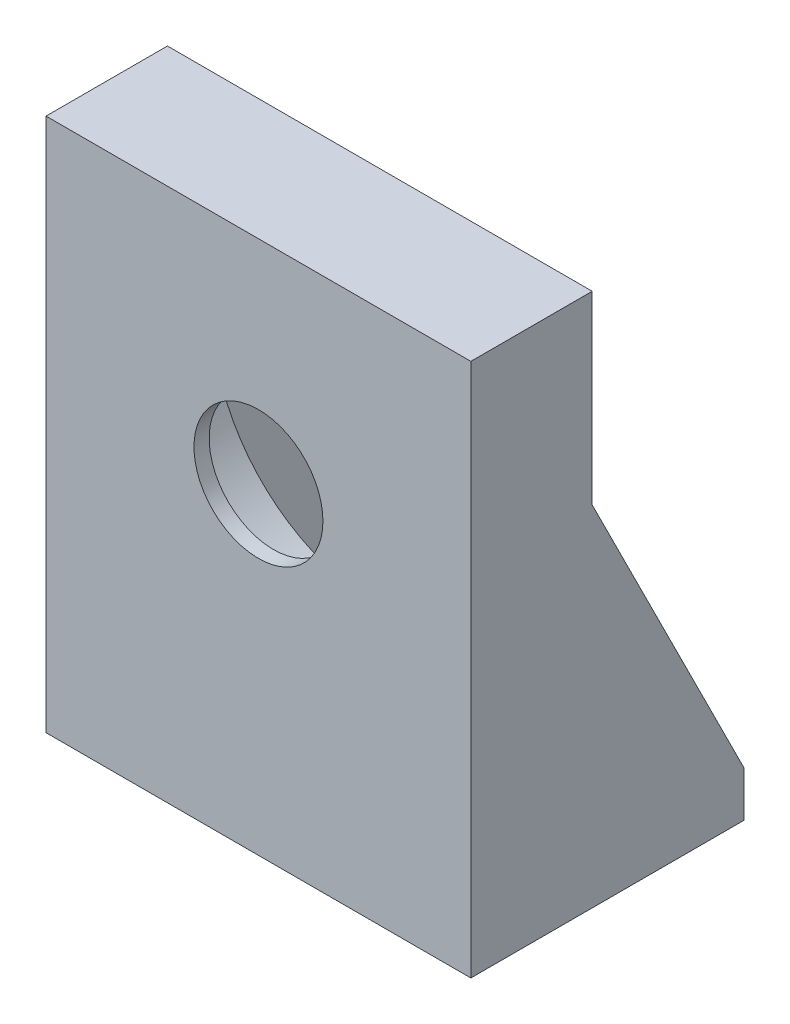
ISO-10303-21;
HEADER;
FILE_DESCRIPTION(('STEP AP214'),'2;1');
FILE_NAME('part.step','',(''),(''),'','','');
FILE_SCHEMA(('AUTOMOTIVE_DESIGN { 1 0 10303 214 1 1 1 1 }'));
ENDSEC;
DATA;
#1=APPLICATION_CONTEXT('core data for automotive mechanical design processes');
#2=APPLICATION_PROTOCOL_DEFINITION('international standard','automotive_design',2000,#1);
#3=PRODUCT_CONTEXT('',#1,'mechanical');
#4=PRODUCT('Part','Part','',(#3));
#5=PRODUCT_RELATED_PRODUCT_CATEGORY('part','',(#4));
#6=PRODUCT_DEFINITION_FORMATION('','',#4);
#7=PRODUCT_DEFINITION_CONTEXT('part definition',#1,'design');
#8=PRODUCT_DEFINITION('design','',#6,#7);
#9=PRODUCT_DEFINITION_SHAPE('','',#8);
#10=(LENGTH_UNIT() NAMED_UNIT(*) SI_UNIT(.MILLI.,.METRE.));
#11=(NAMED_UNIT(*) PLANE_ANGLE_UNIT() SI_UNIT($,.RADIAN.));
#12=(NAMED_UNIT(*) SI_UNIT($,.STERADIAN.) SOLID_ANGLE_UNIT());
#13=UNCERTAINTY_MEASURE_WITH_UNIT(LENGTH_MEASURE(1.E-05),#10,'distance_accuracy_value','');
#14=(GEOMETRIC_REPRESENTATION_CONTEXT(3) GLOBAL_UNCERTAINTY_ASSIGNED_CONTEXT((#13)) GLOBAL_UNIT_ASSIGNED_CONTEXT((#10,
#11,#12)) REPRESENTATION_CONTEXT('',''));
#15=CARTESIAN_POINT('',(0.,0.,0.));
#16=DIRECTION('',(0.,0.,1.));
#17=DIRECTION('',(1.,0.,0.));
#18=AXIS2_PLACEMENT_3D('',#15,#16,#17);
#19=CARTESIAN_POINT('',(-78.7321078244736,23.0359502095329,-9.53844798598299));
#20=DIRECTION('',(0.,0.,1.00000000000001));
#21=DIRECTION('',(0.99999999999995,0.,0.));
#22=AXIS2_PLACEMENT_3D('',#19,#20,#21);
#23=PLANE('',#22);
#24=DIRECTION('',(0.,-1.,0.));
#25=VECTOR('',#24,1.);
#26=CARTESIAN_POINT('',(-67.7321078244726,0.,-9.53844798598301));
#27=LINE('',#26,#25);
#28=CARTESIAN_POINT('',(-67.7321078244728,23.0359502095306,-9.53844798598299));
#29=VERTEX_POINT('',#28);
#30=CARTESIAN_POINT('',(-67.7321078244726,4.83595020952913,-9.53844798598301));
#31=VERTEX_POINT('',#30);
#32=EDGE_CURVE('E60',#29,#31,#27,.T.);
#33=ORIENTED_EDGE('',*,*,#32,.T.);
#34=DIRECTION('',(-1.,0.,0.));
#35=VECTOR('',#34,1.);
#36=CARTESIAN_POINT('',(-54.2918013155621,4.83595020952913,-9.53844798598301));
#37=LINE('',#36,#35);
#38=CARTESIAN_POINT('',(-89.7321078244726,4.83595020952913,-9.53844798598301));
#39=VERTEX_POINT('',#38);
#40=EDGE_CURVE('E196',#31,#39,#37,.T.);
#41=ORIENTED_EDGE('',*,*,#40,.T.);
#42=DIRECTION('',(0.,-1.,0.));
#43=VECTOR('',#42,1.);
#44=CARTESIAN_POINT('',(-89.7321078244726,0.,-9.53844798598301));
#45=LINE('',#44,#43);
#46=CARTESIAN_POINT('',(-89.7321078244727,23.0359502095306,-9.538447985983));
#47=VERTEX_POINT('',#46);
#48=EDGE_CURVE('E182',#47,#39,#45,.T.);
#49=ORIENTED_EDGE('',*,*,#48,.F.);
#50=CARTESIAN_POINT('',(-78.7321078244726,23.0359502095306,-9.53844798598299));
#51=DIRECTION('',(0.,0.,1.00000000000001));
#52=DIRECTION('',(0.,-1.,0.));
#53=AXIS2_PLACEMENT_3D('',#50,#51,#52);
#54=CIRCLE('',#53,10.9999999999998);
#55=EDGE_CURVE('E44',#29,#47,#54,.F.);
#56=ORIENTED_EDGE('',*,*,#55,.F.);
#57=EDGE_LOOP('',(#33,#41,#49,#56));
#58=FACE_BOUND('',#57,.T.);
#59=ADVANCED_FACE('F35',(#58),#23,.F.);
#60=CARTESIAN_POINT('',(-54.2918013155621,4.83595020952913,0.));
#61=DIRECTION('',(0.,-1.,0.));
#62=DIRECTION('',(0.,0.,-1.));
#63=AXIS2_PLACEMENT_3D('',#60,#61,#62);
#64=PLANE('',#63);
#65=CARTESIAN_POINT('',(-72.7321078244726,4.83595020952913,-14.5384479859829));
#66=DIRECTION('',(0.,1.,0.));
#67=DIRECTION('',(0.,0.,1.));
#68=AXIS2_PLACEMENT_3D('',#65,#66,#67);
#69=CIRCLE('',#68,2.00000000000238);
#70=CARTESIAN_POINT('',(-72.7321078244726,4.83595020952913,-12.5384479859806));
#71=VERTEX_POINT('',#70);
#72=EDGE_CURVE('E156',#71,#71,#69,.T.);
#73=ORIENTED_EDGE('',*,*,#72,.F.);
#74=EDGE_LOOP('',(#73));
#75=FACE_BOUND('',#74,.T.);
#76=CARTESIAN_POINT('',(-84.7321078244726,4.83595020952913,-14.5384479859829));
#77=DIRECTION('',(0.,1.,0.));
#78=DIRECTION('',(0.,0.,-1.));
#79=AXIS2_PLACEMENT_3D('',#76,#77,#78);
#80=CIRCLE('',#79,2.00000000000238);
#81=CARTESIAN_POINT('',(-84.7321078244726,4.83595020952913,-16.5384479859853));
#82=VERTEX_POINT('',#81);
#83=EDGE_CURVE('E162',#82,#82,#80,.T.);
#84=ORIENTED_EDGE('',*,*,#83,.F.);
#85=EDGE_LOOP('',(#84));
#86=FACE_BOUND('',#85,.T.);
#87=DIRECTION('',(0.,0.,1.));
#88=VECTOR('',#87,1.);
#89=CARTESIAN_POINT('',(-67.7321078244726,4.83595020952913,-54.5166649359701));
#90=LINE('',#89,#88);
#91=CARTESIAN_POINT('',(-67.7321078244726,4.83595020952914,-19.5384479859829));
#92=VERTEX_POINT('',#91);
#93=EDGE_CURVE('E165',#92,#31,#90,.T.);
#94=ORIENTED_EDGE('',*,*,#93,.F.);
#95=DIRECTION('',(-1.,0.,0.));
#96=VECTOR('',#95,1.);
#97=CARTESIAN_POINT('',(-54.2918013155621,4.83595020952913,-19.5384479859829));
#98=LINE('',#97,#96);
#99=CARTESIAN_POINT('',(-89.7321078244726,4.83595020952913,-19.5384479859829));
#100=VERTEX_POINT('',#99);
#101=EDGE_CURVE('E195',#92,#100,#98,.T.);
#102=ORIENTED_EDGE('',*,*,#101,.T.);
#103=DIRECTION('',(0.,0.,1.));
#104=VECTOR('',#103,1.);
#105=CARTESIAN_POINT('',(-89.7321078244726,4.83595020952913,0.));
#106=LINE('',#105,#104);
#107=EDGE_CURVE('E179',#100,#39,#106,.T.);
#108=ORIENTED_EDGE('',*,*,#107,.T.);
#109=ORIENTED_EDGE('',*,*,#40,.F.);
#110=EDGE_LOOP('',(#94,#102,#108,#109));
#111=FACE_BOUND('',#110,.T.);
#112=ADVANCED_FACE('F260',(#75,#86,#111),#64,.F.);
#113=DIRECTION('',(0.,1.,0.));
#114=VECTOR('',#113,1.);
#115=CARTESIAN_POINT('',(-64.7321078244726,0.,-9.538447985983));
#116=LINE('',#115,#114);
#117=CARTESIAN_POINT('',(-64.7321078244726,24.8359502095291,-9.53844798598299));
#118=VERTEX_POINT('',#117);
#119=CARTESIAN_POINT('',(-64.7321078244726,37.0359502095306,-9.53844798598299));
#120=VERTEX_POINT('',#119);
#121=EDGE_CURVE('E120',#118,#120,#116,.T.);
#122=ORIENTED_EDGE('',*,*,#121,.F.);
#123=DIRECTION('',(1.,0.,0.));
#124=VECTOR('',#123,1.);
#125=CARTESIAN_POINT('',(-67.7321078244726,24.835950209529,-9.53844798598299));
#126=LINE('',#125,#124);
#127=CARTESIAN_POINT('',(-67.7321078244726,24.835950209529,-9.53844798598299));
#128=VERTEX_POINT('',#127);
#129=EDGE_CURVE('E52',#128,#118,#126,.T.);
#130=ORIENTED_EDGE('',*,*,#129,.F.);
#131=EDGE_CURVE('E168',#128,#29,#27,.T.);
#132=ORIENTED_EDGE('',*,*,#131,.T.);
#133=EDGE_CURVE('E11',#47,#29,#54,.F.);
#134=ORIENTED_EDGE('',*,*,#133,.F.);
#135=CARTESIAN_POINT('',(-89.7321078244726,24.835950209529,-9.538447985983));
#136=VERTEX_POINT('',#135);
#137=EDGE_CURVE('E183',#136,#47,#45,.T.);
#138=ORIENTED_EDGE('',*,*,#137,.F.);
#139=DIRECTION('',(-1.,0.,0.));
#140=VECTOR('',#139,1.);
#141=CARTESIAN_POINT('',(-89.7321078244726,24.835950209529,-9.538447985983));
#142=LINE('',#141,#140);
#143=CARTESIAN_POINT('',(-92.7321078244726,24.835950209529,-9.538447985983));
#144=VERTEX_POINT('',#143);
#145=EDGE_CURVE('E189',#136,#144,#142,.T.);
#146=ORIENTED_EDGE('',*,*,#145,.T.);
#147=DIRECTION('',(0.,1.,0.));
#148=VECTOR('',#147,1.);
#149=CARTESIAN_POINT('',(-92.7321078244726,0.,-9.53844798598301));
#150=LINE('',#149,#148);
#151=CARTESIAN_POINT('',(-92.7321078244726,37.0359502095306,-9.53844798598299));
#152=VERTEX_POINT('',#151);
#153=EDGE_CURVE('E206',#144,#152,#150,.T.);
#154=ORIENTED_EDGE('',*,*,#153,.T.);
#155=DIRECTION('',(-1.,0.,0.));
#156=VECTOR('',#155,1.);
#157=CARTESIAN_POINT('',(0.,37.0359502095306,-9.53844798598297));
#158=LINE('',#157,#156);
#159=EDGE_CURVE('E39',#120,#152,#158,.T.);
#160=ORIENTED_EDGE('',*,*,#159,.F.);
#161=EDGE_LOOP('',(#122,#130,#132,#134,#138,#146,#154,#160));
#162=FACE_BOUND('',#161,.T.);
#163=ADVANCED_FACE('F235',(#162),#23,.F.);
#164=CARTESIAN_POINT('',(-78.7321078244726,23.0359502095306,-54.5166649359701));
#165=DIRECTION('',(0.,0.,1.));
#166=DIRECTION('',(1.,0.,0.));
#167=AXIS2_PLACEMENT_3D('',#164,#165,#166);
#168=CYLINDRICAL_SURFACE('',#167,10.9999999999998);
#169=ORIENTED_EDGE('',*,*,#133,.T.);
#170=ORIENTED_EDGE('',*,*,#55,.T.);
#171=EDGE_LOOP('',(#169,#170));
#172=FACE_BOUND('',#171,.T.);
#173=CARTESIAN_POINT('',(-78.7321078244726,23.0359502095306,-2.53844798598293));
#174=DIRECTION('',(0.,0.,1.));
#175=DIRECTION('',(1.,0.,0.));
#176=AXIS2_PLACEMENT_3D('',#173,#174,#175);
#177=CIRCLE('',#176,10.9999999999998);
#178=CARTESIAN_POINT('',(-67.7321078244728,23.0359502095306,-2.53844798598293));
#179=VERTEX_POINT('',#178);
#180=EDGE_CURVE('E149',#179,#179,#177,.T.);
#181=ORIENTED_EDGE('',*,*,#180,.T.);
#182=EDGE_LOOP('',(#181));
#183=FACE_BOUND('',#182,.T.);
#184=ADVANCED_FACE('F37',(#172,#183),#168,.F.);
#185=CARTESIAN_POINT('',(0.,37.0359502095306,-54.5166649359701));
#186=DIRECTION('',(0.,-1.,0.));
#187=DIRECTION('',(0.,0.,-1.));
#188=AXIS2_PLACEMENT_3D('',#185,#186,#187);
#189=PLANE('',#188);
#190=DIRECTION('',(0.,0.,1.));
#191=VECTOR('',#190,1.);
#192=CARTESIAN_POINT('',(-64.7321078244726,37.0359502095306,-54.5166649359701));
#193=LINE('',#192,#191);
#194=CARTESIAN_POINT('',(-64.7321078244726,37.0359502095306,-1.53844798598293));
#195=VERTEX_POINT('',#194);
#196=EDGE_CURVE('E115',#120,#195,#193,.T.);
#197=ORIENTED_EDGE('',*,*,#196,.F.);
#198=ORIENTED_EDGE('',*,*,#159,.T.);
#199=DIRECTION('',(0.,0.,1.));
#200=VECTOR('',#199,1.);
#201=CARTESIAN_POINT('',(-92.7321078244726,37.0359502095306,-54.5166649359701));
#202=LINE('',#201,#200);
#203=CARTESIAN_POINT('',(-92.7321078244726,37.0359502095306,-1.53844798598293));
#204=VERTEX_POINT('',#203);
#205=EDGE_CURVE('E125',#152,#204,#202,.T.);
#206=ORIENTED_EDGE('',*,*,#205,.T.);
#207=DIRECTION('',(1.,0.,0.));
#208=VECTOR('',#207,1.);
#209=CARTESIAN_POINT('',(0.,37.0359502095306,-1.53844798598293));
#210=LINE('',#209,#208);
#211=EDGE_CURVE('E133',#204,#195,#210,.T.);
#212=ORIENTED_EDGE('',*,*,#211,.T.);
#213=EDGE_LOOP('',(#197,#198,#206,#212));
#214=FACE_BOUND('',#213,.T.);
#215=ADVANCED_FACE('F138',(#214),#189,.F.);
#216=CARTESIAN_POINT('',(-92.7321078244726,0.,-54.5166649359701));
#217=DIRECTION('',(-1.,0.,0.));
#218=DIRECTION('',(0.,0.,1.));
#219=AXIS2_PLACEMENT_3D('',#216,#217,#218);
#220=PLANE('',#219);
#221=ORIENTED_EDGE('',*,*,#153,.F.);
#222=DIRECTION('',(0.,0.894427190999916,0.447213595499958));
#223=VECTOR('',#222,1.);
#224=CARTESIAN_POINT('',(-92.7321078244726,8.78256923629901,-17.565138472598));
#225=LINE('',#224,#223);
#226=CARTESIAN_POINT('',(-92.7321078244726,4.83595020952913,-19.5384479859829));
#227=VERTEX_POINT('',#226);
#228=EDGE_CURVE('E175',#227,#144,#225,.T.);
#229=ORIENTED_EDGE('',*,*,#228,.F.);
#230=DIRECTION('',(0.,1.,0.));
#231=VECTOR('',#230,1.);
#232=CARTESIAN_POINT('',(-92.7321078244726,0.,-19.5384479859829));
#233=LINE('',#232,#231);
#234=CARTESIAN_POINT('',(-92.7321078244726,1.83595020952913,-19.5384479859829));
#235=VERTEX_POINT('',#234);
#236=EDGE_CURVE('E191',#235,#227,#233,.T.);
#237=ORIENTED_EDGE('',*,*,#236,.F.);
#238=DIRECTION('',(0.,0.,1.));
#239=VECTOR('',#238,1.);
#240=CARTESIAN_POINT('',(-92.7321078244726,1.83595020952913,-54.5166649359701));
#241=LINE('',#240,#239);
#242=CARTESIAN_POINT('',(-92.7321078244726,1.83595020952913,-1.53844798598293));
#243=VERTEX_POINT('',#242);
#244=EDGE_CURVE('E213',#235,#243,#241,.T.);
#245=ORIENTED_EDGE('',*,*,#244,.T.);
#246=DIRECTION('',(0.,-1.,0.));
#247=VECTOR('',#246,1.);
#248=CARTESIAN_POINT('',(-92.7321078244726,0.,-1.53844798598293));
#249=LINE('',#248,#247);
#250=EDGE_CURVE('E141',#204,#243,#249,.T.);
#251=ORIENTED_EDGE('',*,*,#250,.F.);
#252=ORIENTED_EDGE('',*,*,#205,.F.);
#253=EDGE_LOOP('',(#221,#229,#237,#245,#251,#252));
#254=FACE_BOUND('',#253,.T.);
#255=ADVANCED_FACE('F218',(#254),#220,.T.);
#256=CARTESIAN_POINT('',(0.,1.83595020952915,-54.5166649359701));
#257=DIRECTION('',(0.,-1.,0.));
#258=DIRECTION('',(1.,0.,0.));
#259=AXIS2_PLACEMENT_3D('',#256,#257,#258);
#260=PLANE('',#259);
#261=CARTESIAN_POINT('',(-72.7321078244726,1.83595020952913,-14.5384479859829));
#262=DIRECTION('',(0.,1.,0.));
#263=DIRECTION('',(0.,0.,1.));
#264=AXIS2_PLACEMENT_3D('',#261,#262,#263);
#265=CIRCLE('',#264,2.00000000000238);
#266=CARTESIAN_POINT('',(-72.7321078244726,1.83595020952913,-12.5384479859806));
#267=VERTEX_POINT('',#266);
#268=EDGE_CURVE('E152',#267,#267,#265,.T.);
#269=ORIENTED_EDGE('',*,*,#268,.T.);
#270=EDGE_LOOP('',(#269));
#271=FACE_BOUND('',#270,.T.);
#272=CARTESIAN_POINT('',(-84.7321078244726,1.83595020952913,-14.5384479859829));
#273=DIRECTION('',(0.,1.,0.));
#274=DIRECTION('',(0.,0.,-1.));
#275=AXIS2_PLACEMENT_3D('',#272,#273,#274);
#276=CIRCLE('',#275,2.00000000000238);
#277=CARTESIAN_POINT('',(-84.7321078244726,1.83595020952913,-16.5384479859853));
#278=VERTEX_POINT('',#277);
#279=EDGE_CURVE('E159',#278,#278,#276,.T.);
#280=ORIENTED_EDGE('',*,*,#279,.T.);
#281=EDGE_LOOP('',(#280));
#282=FACE_BOUND('',#281,.T.);
#283=ORIENTED_EDGE('',*,*,#244,.F.);
#284=DIRECTION('',(-1.,0.,0.));
#285=VECTOR('',#284,1.);
#286=CARTESIAN_POINT('',(-54.2918013155621,1.83595020952913,-19.5384479859829));
#287=LINE('',#286,#285);
#288=CARTESIAN_POINT('',(-64.7321078244726,1.83595020952913,-19.5384479859829));
#289=VERTEX_POINT('',#288);
#290=EDGE_CURVE('E198',#289,#235,#287,.T.);
#291=ORIENTED_EDGE('',*,*,#290,.F.);
#292=DIRECTION('',(0.,0.,1.));
#293=VECTOR('',#292,1.);
#294=CARTESIAN_POINT('',(-64.7321078244726,1.83595020952914,-54.5166649359701));
#295=LINE('',#294,#293);
#296=CARTESIAN_POINT('',(-64.7321078244726,1.83595020952914,-1.53844798598293));
#297=VERTEX_POINT('',#296);
#298=EDGE_CURVE('E211',#289,#297,#295,.T.);
#299=ORIENTED_EDGE('',*,*,#298,.T.);
#300=DIRECTION('',(1.,0.,0.));
#301=VECTOR('',#300,1.);
#302=CARTESIAN_POINT('',(0.,1.83595020952915,-1.53844798598293));
#303=LINE('',#302,#301);
#304=EDGE_CURVE('E135',#243,#297,#303,.T.);
#305=ORIENTED_EDGE('',*,*,#304,.F.);
#306=EDGE_LOOP('',(#283,#291,#299,#305));
#307=FACE_BOUND('',#306,.T.);
#308=ADVANCED_FACE('F222',(#271,#282,#307),#260,.T.);
#309=CARTESIAN_POINT('',(-64.7321078244726,0.,-54.5166649359701));
#310=DIRECTION('',(-1.,0.,0.));
#311=DIRECTION('',(0.,0.,1.));
#312=AXIS2_PLACEMENT_3D('',#309,#310,#311);
#313=PLANE('',#312);
#314=DIRECTION('',(0.,-1.,0.));
#315=VECTOR('',#314,1.);
#316=CARTESIAN_POINT('',(-64.7321078244726,0.,-19.5384479859829));
#317=LINE('',#316,#315);
#318=CARTESIAN_POINT('',(-64.7321078244726,4.83595020952913,-19.5384479859829));
#319=VERTEX_POINT('',#318);
#320=EDGE_CURVE('E126',#319,#289,#317,.T.);
#321=ORIENTED_EDGE('',*,*,#320,.F.);
#322=DIRECTION('',(0.,0.894427190999916,0.447213595499958));
#323=VECTOR('',#322,1.);
#324=CARTESIAN_POINT('',(-64.7321078244726,-13.024096738089,-28.468471459792));
#325=LINE('',#324,#323);
#326=EDGE_CURVE('E155',#319,#118,#325,.T.);
#327=ORIENTED_EDGE('',*,*,#326,.T.);
#328=ORIENTED_EDGE('',*,*,#121,.T.);
#329=ORIENTED_EDGE('',*,*,#196,.T.);
#330=DIRECTION('',(0.,-1.,0.));
#331=VECTOR('',#330,1.);
#332=CARTESIAN_POINT('',(-64.7321078244726,0.,-1.53844798598293));
#333=LINE('',#332,#331);
#334=EDGE_CURVE('E118',#195,#297,#333,.T.);
#335=ORIENTED_EDGE('',*,*,#334,.T.);
#336=ORIENTED_EDGE('',*,*,#298,.F.);
#337=EDGE_LOOP('',(#321,#327,#328,#329,#335,#336));
#338=FACE_BOUND('',#337,.T.);
#339=ADVANCED_FACE('F117',(#338),#313,.F.);
#340=CARTESIAN_POINT('',(-54.2918013155621,0.,-19.5384479859829));
#341=DIRECTION('',(0.,0.,1.));
#342=DIRECTION('',(1.,0.,0.));
#343=AXIS2_PLACEMENT_3D('',#340,#341,#342);
#344=PLANE('',#343);
#345=EDGE_CURVE('E201',#319,#92,#98,.T.);
#346=ORIENTED_EDGE('',*,*,#345,.F.);
#347=ORIENTED_EDGE('',*,*,#320,.T.);
#348=ORIENTED_EDGE('',*,*,#290,.T.);
#349=ORIENTED_EDGE('',*,*,#236,.T.);
#350=DIRECTION('',(-1.,0.,0.));
#351=VECTOR('',#350,1.);
#352=CARTESIAN_POINT('',(-89.7321078244726,4.83595020952913,-19.5384479859829));
#353=LINE('',#352,#351);
#354=EDGE_CURVE('E186',#100,#227,#353,.T.);
#355=ORIENTED_EDGE('',*,*,#354,.F.);
#356=ORIENTED_EDGE('',*,*,#101,.F.);
#357=EDGE_LOOP('',(#346,#347,#348,#349,#355,#356));
#358=FACE_BOUND('',#357,.T.);
#359=ADVANCED_FACE('F226',(#358),#344,.F.);
#360=CARTESIAN_POINT('',(-89.7321078244726,8.78256923629901,-17.565138472598));
#361=DIRECTION('',(0.,-0.447213595499958,0.894427190999916));
#362=DIRECTION('',(0.,-0.894427190999916,-0.447213595499958));
#363=AXIS2_PLACEMENT_3D('',#360,#361,#362);
#364=PLANE('',#363);
#365=ORIENTED_EDGE('',*,*,#228,.T.);
#366=ORIENTED_EDGE('',*,*,#145,.F.);
#367=DIRECTION('',(0.,0.894427190999916,0.447213595499958));
#368=VECTOR('',#367,1.);
#369=CARTESIAN_POINT('',(-89.7321078244726,8.78256923629901,-17.565138472598));
#370=LINE('',#369,#368);
#371=EDGE_CURVE('E176',#100,#136,#370,.T.);
#372=ORIENTED_EDGE('',*,*,#371,.F.);
#373=ORIENTED_EDGE('',*,*,#354,.T.);
#374=EDGE_LOOP('',(#365,#366,#372,#373));
#375=FACE_BOUND('',#374,.T.);
#376=ADVANCED_FACE('F307',(#375),#364,.F.);
#377=CARTESIAN_POINT('',(-89.7321078244726,0.,0.));
#378=DIRECTION('',(-1.,0.,0.));
#379=DIRECTION('',(0.,0.,1.));
#380=AXIS2_PLACEMENT_3D('',#377,#378,#379);
#381=PLANE('',#380);
#382=ORIENTED_EDGE('',*,*,#371,.T.);
#383=ORIENTED_EDGE('',*,*,#137,.T.);
#384=ORIENTED_EDGE('',*,*,#48,.T.);
#385=ORIENTED_EDGE('',*,*,#107,.F.);
#386=EDGE_LOOP('',(#382,#383,#384,#385));
#387=FACE_BOUND('',#386,.T.);
#388=ADVANCED_FACE('F315',(#387),#381,.F.);
#389=CARTESIAN_POINT('',(-67.7321078244726,-13.024096738089,-28.468471459792));
#390=DIRECTION('',(0.,0.447213595499958,-0.894427190999916));
#391=DIRECTION('',(0.,0.894427190999916,0.447213595499958));
#392=AXIS2_PLACEMENT_3D('',#389,#390,#391);
#393=PLANE('',#392);
#394=ORIENTED_EDGE('',*,*,#326,.F.);
#395=ORIENTED_EDGE('',*,*,#345,.T.);
#396=DIRECTION('',(0.,0.894427190999916,0.447213595499958));
#397=VECTOR('',#396,1.);
#398=CARTESIAN_POINT('',(-67.7321078244726,-13.024096738089,-28.468471459792));
#399=LINE('',#398,#397);
#400=EDGE_CURVE('E170',#92,#128,#399,.T.);
#401=ORIENTED_EDGE('',*,*,#400,.T.);
#402=ORIENTED_EDGE('',*,*,#129,.T.);
#403=EDGE_LOOP('',(#394,#395,#401,#402));
#404=FACE_BOUND('',#403,.T.);
#405=ADVANCED_FACE('F231',(#404),#393,.T.);
#406=CARTESIAN_POINT('',(-67.7321078244726,0.,0.));
#407=DIRECTION('',(1.,0.,0.));
#408=DIRECTION('',(0.,0.,-1.));
#409=AXIS2_PLACEMENT_3D('',#406,#407,#408);
#410=PLANE('',#409);
#411=ORIENTED_EDGE('',*,*,#93,.T.);
#412=ORIENTED_EDGE('',*,*,#32,.F.);
#413=ORIENTED_EDGE('',*,*,#131,.F.);
#414=ORIENTED_EDGE('',*,*,#400,.F.);
#415=EDGE_LOOP('',(#411,#412,#413,#414));
#416=FACE_BOUND('',#415,.T.);
#417=ADVANCED_FACE('F233',(#416),#410,.F.);
#418=CARTESIAN_POINT('',(-84.7321078244726,1.83595020952913,-14.5384479859829));
#419=DIRECTION('',(0.,1.,0.));
#420=DIRECTION('',(0.,0.,1.));
#421=AXIS2_PLACEMENT_3D('',#418,#419,#420);
#422=CYLINDRICAL_SURFACE('',#421,2.00000000000238);
#423=ORIENTED_EDGE('',*,*,#279,.F.);
#424=EDGE_LOOP('',(#423));
#425=FACE_BOUND('',#424,.T.);
#426=ORIENTED_EDGE('',*,*,#83,.T.);
#427=EDGE_LOOP('',(#426));
#428=FACE_BOUND('',#427,.T.);
#429=ADVANCED_FACE('F255',(#425,#428),#422,.F.);
#430=CARTESIAN_POINT('',(-72.7321078244726,1.83595020952913,-14.5384479859829));
#431=DIRECTION('',(0.,1.,0.));
#432=DIRECTION('',(0.,0.,1.));
#433=AXIS2_PLACEMENT_3D('',#430,#431,#432);
#434=CYLINDRICAL_SURFACE('',#433,2.00000000000238);
#435=ORIENTED_EDGE('',*,*,#268,.F.);
#436=EDGE_LOOP('',(#435));
#437=FACE_BOUND('',#436,.T.);
#438=ORIENTED_EDGE('',*,*,#72,.T.);
#439=EDGE_LOOP('',(#438));
#440=FACE_BOUND('',#439,.T.);
#441=ADVANCED_FACE('F246',(#437,#440),#434,.F.);
#442=CARTESIAN_POINT('',(0.,0.,-2.53844798598293));
#443=DIRECTION('',(0.,0.,1.));
#444=DIRECTION('',(1.,0.,0.));
#445=AXIS2_PLACEMENT_3D('',#442,#443,#444);
#446=PLANE('',#445);
#447=CARTESIAN_POINT('',(-78.7321078244726,23.0359502095306,-2.53844798598293));
#448=DIRECTION('',(0.,0.,1.));
#449=DIRECTION('',(1.,0.,0.));
#450=AXIS2_PLACEMENT_3D('',#447,#448,#449);
#451=CIRCLE('',#450,4.24999999999981);
#452=CARTESIAN_POINT('',(-74.4821078244728,23.0359502095306,-2.53844798598293));
#453=VERTEX_POINT('',#452);
#454=EDGE_CURVE('E136',#453,#453,#451,.T.);
#455=ORIENTED_EDGE('',*,*,#454,.T.);
#456=EDGE_LOOP('',(#455));
#457=FACE_BOUND('',#456,.T.);
#458=ORIENTED_EDGE('',*,*,#180,.F.);
#459=EDGE_LOOP('',(#458));
#460=FACE_BOUND('',#459,.T.);
#461=ADVANCED_FACE('F243',(#457,#460),#446,.F.);
#462=CARTESIAN_POINT('',(-78.7321078244726,23.0359502095306,-1.53844798598293));
#463=DIRECTION('',(0.,0.,-1.));
#464=DIRECTION('',(-1.,0.,0.));
#465=AXIS2_PLACEMENT_3D('',#462,#463,#464);
#466=CYLINDRICAL_SURFACE('',#465,4.24999999999981);
#467=CARTESIAN_POINT('',(-78.7321078244726,23.0359502095306,-1.53844798598293));
#468=DIRECTION('',(0.,0.,1.));
#469=DIRECTION('',(1.,0.,0.));
#470=AXIS2_PLACEMENT_3D('',#467,#468,#469);
#471=CIRCLE('',#470,4.24999999999981);
#472=CARTESIAN_POINT('',(-74.4821078244728,23.0359502095306,-1.53844798598293));
#473=VERTEX_POINT('',#472);
#474=EDGE_CURVE('E146',#473,#473,#471,.T.);
#475=ORIENTED_EDGE('',*,*,#474,.T.);
#476=EDGE_LOOP('',(#475));
#477=FACE_BOUND('',#476,.T.);
#478=ORIENTED_EDGE('',*,*,#454,.F.);
#479=EDGE_LOOP('',(#478));
#480=FACE_BOUND('',#479,.T.);
#481=ADVANCED_FACE('F245',(#477,#480),#466,.F.);
#482=CARTESIAN_POINT('',(0.,0.,-1.53844798598293));
#483=DIRECTION('',(0.,0.,1.));
#484=DIRECTION('',(1.,0.,0.));
#485=AXIS2_PLACEMENT_3D('',#482,#483,#484);
#486=PLANE('',#485);
#487=ORIENTED_EDGE('',*,*,#334,.F.);
#488=ORIENTED_EDGE('',*,*,#211,.F.);
#489=ORIENTED_EDGE('',*,*,#250,.T.);
#490=ORIENTED_EDGE('',*,*,#304,.T.);
#491=EDGE_LOOP('',(#487,#488,#489,#490));
#492=FACE_BOUND('',#491,.T.);
#493=ORIENTED_EDGE('',*,*,#474,.F.);
#494=EDGE_LOOP('',(#493));
#495=FACE_BOUND('',#494,.T.);
#496=ADVANCED_FACE('F130',(#492,#495),#486,.T.);
#497=CLOSED_SHELL('',(#59,#112,#163,#184,#215,#255,#308,#339,#359,#376,#388,#405,#417,#429,#441,
#461,#481,#496));
#498=MANIFOLD_SOLID_BREP('B2',#497);
#499=ADVANCED_BREP_SHAPE_REPRESENTATION('',(#18,#498),#14);
#500=SHAPE_DEFINITION_REPRESENTATION(#9,#499);
ENDSEC;
END-ISO-10303-21;
